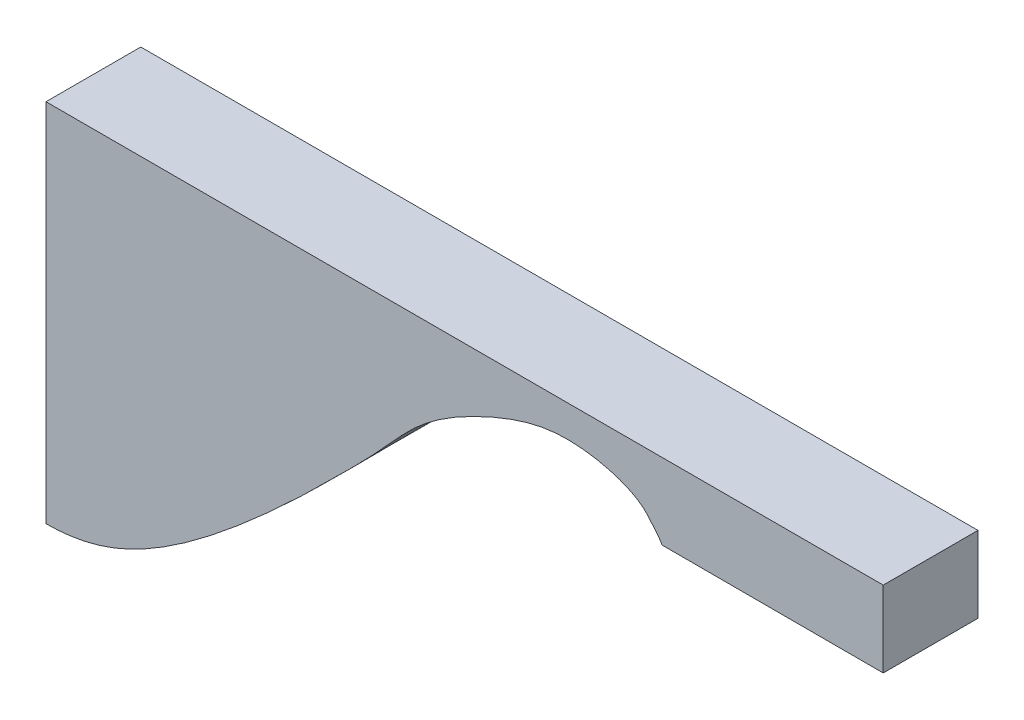
ISO-10303-21;
HEADER;
FILE_DESCRIPTION(('STEP AP214'),'2;1');
FILE_NAME('part.step','',(''),(''),'','','');
FILE_SCHEMA(('AUTOMOTIVE_DESIGN { 1 0 10303 214 1 1 1 1 }'));
ENDSEC;
DATA;
#1=APPLICATION_CONTEXT('core data for automotive mechanical design processes');
#2=APPLICATION_PROTOCOL_DEFINITION('international standard','automotive_design',2000,#1);
#3=PRODUCT_CONTEXT('',#1,'mechanical');
#4=PRODUCT('Part','Part','',(#3));
#5=PRODUCT_RELATED_PRODUCT_CATEGORY('part','',(#4));
#6=PRODUCT_DEFINITION_FORMATION('','',#4);
#7=PRODUCT_DEFINITION_CONTEXT('part definition',#1,'design');
#8=PRODUCT_DEFINITION('design','',#6,#7);
#9=PRODUCT_DEFINITION_SHAPE('','',#8);
#10=(LENGTH_UNIT() NAMED_UNIT(*) SI_UNIT(.MILLI.,.METRE.));
#11=(NAMED_UNIT(*) PLANE_ANGLE_UNIT() SI_UNIT($,.RADIAN.));
#12=(NAMED_UNIT(*) SI_UNIT($,.STERADIAN.) SOLID_ANGLE_UNIT());
#13=UNCERTAINTY_MEASURE_WITH_UNIT(LENGTH_MEASURE(1.E-05),#10,'distance_accuracy_value','');
#14=(GEOMETRIC_REPRESENTATION_CONTEXT(3) GLOBAL_UNCERTAINTY_ASSIGNED_CONTEXT((#13)) GLOBAL_UNIT_ASSIGNED_CONTEXT((#10,
#11,#12)) REPRESENTATION_CONTEXT('',''));
#15=CARTESIAN_POINT('',(0.,0.,0.));
#16=DIRECTION('',(0.,0.,1.));
#17=DIRECTION('',(1.,0.,0.));
#18=AXIS2_PLACEMENT_3D('',#15,#16,#17);
#19=CARTESIAN_POINT('',(117.55917187078,-4.17121153115289,59.9999999999997));
#20=DIRECTION('',(0.999999999999814,6.09113935374505E-07,0.));
#21=DIRECTION('',(-6.09113935374505E-07,0.999999999999814,0.));
#22=AXIS2_PLACEMENT_3D('',#19,#20,#21);
#23=PLANE('',#22);
#24=DIRECTION('',(-6.09113935374505E-07,0.999999999999814,0.));
#25=VECTOR('',#24,1.);
#26=CARTESIAN_POINT('',(117.55917187078,-4.17121153115289,67.9999999999997));
#27=LINE('',#26,#25);
#28=CARTESIAN_POINT('',(117.55917187078,-4.17121153115289,67.9999999999997));
#29=VERTEX_POINT('',#28);
#30=CARTESIAN_POINT('',(117.559167955876,2.25600000000004,67.9999999999997));
#31=VERTEX_POINT('',#30);
#32=EDGE_CURVE('E154',#29,#31,#27,.T.);
#33=ORIENTED_EDGE('',*,*,#32,.F.);
#34=DIRECTION('',(0.,0.,1.));
#35=VECTOR('',#34,1.);
#36=CARTESIAN_POINT('',(117.55917187078,-4.17121153115289,59.9999999999997));
#37=LINE('',#36,#35);
#38=CARTESIAN_POINT('',(117.55917187078,-4.17121153115289,59.9999999999997));
#39=VERTEX_POINT('',#38);
#40=EDGE_CURVE('E11',#39,#29,#37,.T.);
#41=ORIENTED_EDGE('',*,*,#40,.F.);
#42=DIRECTION('',(-6.09113935374505E-07,0.999999999999814,0.));
#43=VECTOR('',#42,1.);
#44=CARTESIAN_POINT('',(117.55917187078,-4.17121153115289,59.9999999999997));
#45=LINE('',#44,#43);
#46=CARTESIAN_POINT('',(117.559167955876,2.25600000000004,59.9999999999997));
#47=VERTEX_POINT('',#46);
#48=EDGE_CURVE('E108',#39,#47,#45,.T.);
#49=ORIENTED_EDGE('',*,*,#48,.T.);
#50=DIRECTION('',(0.,0.,1.));
#51=VECTOR('',#50,1.);
#52=CARTESIAN_POINT('',(117.559167955876,2.25600000000004,59.9999999999997));
#53=LINE('',#52,#51);
#54=EDGE_CURVE('E77',#47,#31,#53,.T.);
#55=ORIENTED_EDGE('',*,*,#54,.T.);
#56=EDGE_LOOP('',(#33,#41,#49,#55));
#57=FACE_BOUND('',#56,.T.);
#58=ADVANCED_FACE('F30',(#57),#23,.T.);
#59=CARTESIAN_POINT('',(98.8755610018275,-4.15342704151391,59.9999999999997));
#60=CARTESIAN_POINT('',(105.103431048449,-4.15960524690506,59.9999999999997));
#61=CARTESIAN_POINT('',(111.331301380457,-4.16549807274983,59.9999999999997));
#62=CARTESIAN_POINT('',(117.55917187078,-4.17121153115289,59.9999999999997));
#63=B_SPLINE_CURVE_WITH_KNOTS('',3,(#59,#60,#61,#62),.UNSPECIFIED.,.F.,.F.,(4,4),(0.,1.),.UNSPECIFIED.);
#64=DIRECTION('',(0.,0.,1.));
#65=VECTOR('',#64,1.);
#66=SURFACE_OF_LINEAR_EXTRUSION('',#63,#65);
#67=CARTESIAN_POINT('',(117.55917187078,-4.17121153115289,67.9999999999997));
#68=CARTESIAN_POINT('',(111.331301380457,-4.16549807274983,67.9999999999997));
#69=CARTESIAN_POINT('',(105.103431048449,-4.15960524690506,67.9999999999997));
#70=CARTESIAN_POINT('',(98.8755610018275,-4.15342704151391,67.9999999999997));
#71=B_SPLINE_CURVE_WITH_KNOTS('',3,(#67,#68,#69,#70),.UNSPECIFIED.,.F.,.F.,(4,4),(0.,1.),.UNSPECIFIED.);
#72=CARTESIAN_POINT('',(98.8755610018274,-4.15342704151393,67.9999999999997));
#73=VERTEX_POINT('',#72);
#74=EDGE_CURVE('E150',#73,#29,#71,.F.);
#75=ORIENTED_EDGE('',*,*,#74,.F.);
#76=DIRECTION('',(0.,0.,1.));
#77=VECTOR('',#76,1.);
#78=CARTESIAN_POINT('',(98.8755610018274,-4.15342704151393,59.9999999999997));
#79=LINE('',#78,#77);
#80=CARTESIAN_POINT('',(98.8755610018274,-4.15342704151393,59.9999999999997));
#81=VERTEX_POINT('',#80);
#82=EDGE_CURVE('E39',#81,#73,#79,.T.);
#83=ORIENTED_EDGE('',*,*,#82,.F.);
#84=CARTESIAN_POINT('',(98.8755610018275,-4.15342704151391,59.9999999999997));
#85=CARTESIAN_POINT('',(105.103431048449,-4.15960524690506,59.9999999999997));
#86=CARTESIAN_POINT('',(111.331301380457,-4.16549807274983,59.9999999999997));
#87=CARTESIAN_POINT('',(117.55917187078,-4.17121153115289,59.9999999999997));
#88=B_SPLINE_CURVE_WITH_KNOTS('',3,(#84,#85,#86,#87),.UNSPECIFIED.,.F.,.F.,(4,4),(0.,1.),.UNSPECIFIED.);
#89=EDGE_CURVE('E101',#81,#39,#88,.T.);
#90=ORIENTED_EDGE('',*,*,#89,.T.);
#91=ORIENTED_EDGE('',*,*,#40,.T.);
#92=EDGE_LOOP('',(#75,#83,#90,#91));
#93=FACE_BOUND('',#92,.T.);
#94=ADVANCED_FACE('F133',(#93),#66,.T.);
#95=CARTESIAN_POINT('',(46.8903743110804,-28.596883207131,59.9999999999997));
#96=CARTESIAN_POINT('',(47.5442365086491,-28.5907072029155,59.9999999999997));
#97=CARTESIAN_POINT('',(48.1984598564595,-28.5510189691388,59.9999999999997));
#98=CARTESIAN_POINT('',(49.1804895711758,-28.4270239416478,59.9999999999997));
#99=CARTESIAN_POINT('',(49.5092564045231,-28.3747651557727,59.9999999999997));
#100=CARTESIAN_POINT('',(50.16040333774,-28.2490262914415,59.9999999999997));
#101=CARTESIAN_POINT('',(50.4817734591461,-28.1758546857247,59.9999999999997));
#102=CARTESIAN_POINT('',(52.0687503033664,-27.7612871308645,59.9999999999997));
#103=CARTESIAN_POINT('',(53.2737749166432,-27.2714076819132,59.9999999999997));
#104=CARTESIAN_POINT('',(55.60284513252,-26.0931735739515,59.9999999999997));
#105=CARTESIAN_POINT('',(56.7322555517637,-25.4039539523767,59.9999999999997));
#106=CARTESIAN_POINT('',(58.9087326698377,-23.9357046078205,59.9999999999997));
#107=CARTESIAN_POINT('',(59.9603082250726,-23.1540833850424,59.9999999999997));
#108=CARTESIAN_POINT('',(62.018623710139,-21.5327568403852,59.9999999999997));
#109=CARTESIAN_POINT('',(63.0248066212777,-20.692329906425,59.9999999999997));
#110=CARTESIAN_POINT('',(65.0074640440431,-18.9729891075018,59.9999999999997));
#111=CARTESIAN_POINT('',(65.9840594016845,-18.0939268320721,59.9999999999997));
#112=CARTESIAN_POINT('',(67.9093642016245,-16.307999640975,59.9999999999997));
#113=CARTESIAN_POINT('',(68.857398454762,-15.399138656505,59.9999999999997));
#114=CARTESIAN_POINT('',(70.7347837958604,-13.5624690886792,59.9999999999997));
#115=CARTESIAN_POINT('',(71.6679657509885,-12.6386875895223,59.9999999999997));
#116=CARTESIAN_POINT('',(73.0583569833913,-11.2437425973995,59.9999999999997));
#117=CARTESIAN_POINT('',(73.5189708661399,-10.7759441696053,59.9999999999997));
#118=CARTESIAN_POINT('',(74.428563488617,-9.82884729886254,59.9999999999997));
#119=CARTESIAN_POINT('',(74.8765528139027,-9.34855606107691,59.9999999999997));
#120=CARTESIAN_POINT('',(75.7622049606279,-8.37783042719721,59.9999999999997));
#121=CARTESIAN_POINT('',(76.2019128766526,-7.88948476496503,59.9999999999997));
#122=CARTESIAN_POINT('',(77.0980350594773,-6.9287748212849,59.9999999999997));
#123=CARTESIAN_POINT('',(77.5542044736502,-6.45617631255884,59.9999999999997));
#124=CARTESIAN_POINT('',(78.5210210739398,-5.56309301098736,59.9999999999997));
#125=CARTESIAN_POINT('',(79.0268635605564,-5.14632604593906,59.9999999999997));
#126=CARTESIAN_POINT('',(80.0754781028246,-4.37539755204517,59.9999999999997));
#127=CARTESIAN_POINT('',(80.6189236656623,-4.01983764218453,59.9999999999997));
#128=CARTESIAN_POINT('',(81.7348542963756,-3.35409319665673,59.9999999999997));
#129=CARTESIAN_POINT('',(82.3073098653944,-3.04386256785999,59.9999999999997));
#130=CARTESIAN_POINT('',(83.4735184405562,-2.4566793973969,59.9999999999997));
#131=CARTESIAN_POINT('',(84.0686061951216,-2.18044543676049,59.9999999999997));
#132=CARTESIAN_POINT('',(85.8670792694604,-1.40574282297812,59.9999999999997));
#133=CARTESIAN_POINT('',(87.0882694123907,-0.955937913663051,59.9999999999997));
#134=CARTESIAN_POINT('',(88.6887281436307,-0.615725568518876,59.9999999999997));
#135=CARTESIAN_POINT('',(89.0138183692901,-0.558868330314372,59.9999999999997));
#136=CARTESIAN_POINT('',(89.6671797652833,-0.472591179892097,59.9999999999997));
#137=CARTESIAN_POINT('',(89.9934333310263,-0.443628992558844,59.9999999999997));
#138=CARTESIAN_POINT('',(90.9709588556915,-0.397737427350776,59.9999999999997));
#139=CARTESIAN_POINT('',(91.6210347420661,-0.420505328771319,59.9999999999997));
#140=CARTESIAN_POINT('',(92.9184887265608,-0.555579892475018,59.9999999999997));
#141=CARTESIAN_POINT('',(93.5697346921998,-0.669633948304067,59.9999999999997));
#142=CARTESIAN_POINT('',(94.5253762509196,-0.906623185705946,59.9999999999997));
#143=CARTESIAN_POINT('',(94.8405040691058,-0.996933503547666,59.9999999999997));
#144=CARTESIAN_POINT('',(95.4615432368718,-1.20804932198439,59.9999999999997));
#145=CARTESIAN_POINT('',(95.7686827183471,-1.32861181508982,59.9999999999997));
#146=CARTESIAN_POINT('',(96.3681861005486,-1.60164174256283,59.9999999999997));
#147=CARTESIAN_POINT('',(96.6570230041086,-1.75489089614139,59.9999999999997));
#148=CARTESIAN_POINT('',(97.0616431733103,-2.02866714309261,59.9999999999997));
#149=CARTESIAN_POINT('',(97.1915299362456,-2.12757122270766,59.9999999999997));
#150=CARTESIAN_POINT('',(97.4398770399606,-2.34289799298334,59.9999999999997));
#151=CARTESIAN_POINT('',(97.558295361094,-2.46062166937449,59.9999999999997));
#152=CARTESIAN_POINT('',(97.8974787923898,-2.8261537033274,59.9999999999997));
#153=CARTESIAN_POINT('',(98.1032682205362,-3.08674680923261,59.9999999999997));
#154=CARTESIAN_POINT('',(98.418738253266,-3.4719945639211,59.9999999999997));
#155=CARTESIAN_POINT('',(98.5259969995657,-3.59866278665286,59.9999999999997));
#156=CARTESIAN_POINT('',(98.7282510385825,-3.8621952748899,59.9999999999997));
#157=CARTESIAN_POINT('',(98.8199251527387,-4.00394774024481,59.9999999999997));
#158=CARTESIAN_POINT('',(98.8755610018274,-4.15342704151393,59.9999999999997));
#159=B_SPLINE_CURVE_WITH_KNOTS('',3,(#95,#96,#97,#98,#99,#100,#101,#102,#103,#104,#105,#106,
#107,#108,#109,#110,#111,#112,#113,#114,#115,#116,#117,#118,#119,#120,#121,#122,#123,#124,#125,
#126,#127,#128,#129,#130,#131,#132,#133,#134,#135,#136,#137,#138,#139,#140,#141,#142,#143,#144,
#145,#146,#147,#148,#149,#150,#151,#152,#153,#154,#155,#156,#157,#158),.UNSPECIFIED.,.F.,.F.,(4,
2,2,2,2,2,2,2,2,2,2,2,2,2,2,2,2,2,2,2,2,2,2,2,2,2,2,2,2,2,2,4),(0.,0.0312499999999997,
0.0468749999999998,0.0624999999999998,0.125,0.187499999999999,0.249999999999999,
0.312499999999999,0.374999999999999,0.437499999999999,0.499999999999999,0.531249999999999,
0.562499999999999,0.59375,0.625,0.656249999999999,0.687499999999999,0.718749999999999,
0.749999999999999,0.812499999999999,0.828124999999999,0.843749999999999,0.874999999999999,
0.90625,0.921875,0.9375,0.953125,0.9609375,0.96875,0.984375,0.9921875,1.),.UNSPECIFIED.);
#160=DIRECTION('',(0.,0.,1.));
#161=VECTOR('',#160,1.);
#162=SURFACE_OF_LINEAR_EXTRUSION('',#159,#161);
#163=CARTESIAN_POINT('',(98.8755610018274,-4.15342704151393,67.9999999999996));
#164=CARTESIAN_POINT('',(98.8199251527387,-4.00394774024481,67.9999999999996));
#165=CARTESIAN_POINT('',(98.7282510385825,-3.8621952748899,67.9999999999996));
#166=CARTESIAN_POINT('',(98.5259969995657,-3.59866278665286,67.9999999999996));
#167=CARTESIAN_POINT('',(98.418738253266,-3.4719945639211,67.9999999999996));
#168=CARTESIAN_POINT('',(98.1032682205362,-3.08674680923261,67.9999999999996));
#169=CARTESIAN_POINT('',(97.8974787923898,-2.8261537033274,67.9999999999996));
#170=CARTESIAN_POINT('',(97.558295361094,-2.46062166937449,67.9999999999996));
#171=CARTESIAN_POINT('',(97.4398770399606,-2.34289799298334,67.9999999999996));
#172=CARTESIAN_POINT('',(97.1915299362456,-2.12757122270766,67.9999999999996));
#173=CARTESIAN_POINT('',(97.0616431733103,-2.02866714309261,67.9999999999996));
#174=CARTESIAN_POINT('',(96.6570230041086,-1.75489089614139,67.9999999999996));
#175=CARTESIAN_POINT('',(96.3681861005486,-1.60164174256283,67.9999999999996));
#176=CARTESIAN_POINT('',(95.7686827183471,-1.32861181508982,67.9999999999996));
#177=CARTESIAN_POINT('',(95.4615432368718,-1.20804932198439,67.9999999999996));
#178=CARTESIAN_POINT('',(94.8405040691058,-0.996933503547666,67.9999999999996));
#179=CARTESIAN_POINT('',(94.5253762509196,-0.906623185705946,67.9999999999996));
#180=CARTESIAN_POINT('',(93.5697346921998,-0.669633948304067,67.9999999999996));
#181=CARTESIAN_POINT('',(92.9184887265608,-0.555579892475018,67.9999999999996));
#182=CARTESIAN_POINT('',(91.6210347420661,-0.420505328771319,67.9999999999996));
#183=CARTESIAN_POINT('',(90.9709588556915,-0.397737427350776,67.9999999999996));
#184=CARTESIAN_POINT('',(89.9934333310263,-0.443628992558844,67.9999999999996));
#185=CARTESIAN_POINT('',(89.6671797652833,-0.472591179892097,67.9999999999996));
#186=CARTESIAN_POINT('',(89.0138183692901,-0.558868330314372,67.9999999999996));
#187=CARTESIAN_POINT('',(88.6887281436307,-0.615725568518876,67.9999999999996));
#188=CARTESIAN_POINT('',(87.0882694123907,-0.955937913663051,67.9999999999996));
#189=CARTESIAN_POINT('',(85.8670792694604,-1.40574282297812,67.9999999999996));
#190=CARTESIAN_POINT('',(84.0686061951216,-2.18044543676049,67.9999999999996));
#191=CARTESIAN_POINT('',(83.4735184405562,-2.4566793973969,67.9999999999996));
#192=CARTESIAN_POINT('',(82.3073098653944,-3.04386256785999,67.9999999999996));
#193=CARTESIAN_POINT('',(81.7348542963756,-3.35409319665673,67.9999999999996));
#194=CARTESIAN_POINT('',(80.6189236656623,-4.01983764218453,67.9999999999996));
#195=CARTESIAN_POINT('',(80.0754781028246,-4.37539755204517,67.9999999999996));
#196=CARTESIAN_POINT('',(79.0268635605564,-5.14632604593906,67.9999999999996));
#197=CARTESIAN_POINT('',(78.5210210739398,-5.56309301098736,67.9999999999996));
#198=CARTESIAN_POINT('',(77.5542044736502,-6.45617631255884,67.9999999999996));
#199=CARTESIAN_POINT('',(77.0980350594773,-6.9287748212849,67.9999999999996));
#200=CARTESIAN_POINT('',(76.2019128766526,-7.88948476496503,67.9999999999996));
#201=CARTESIAN_POINT('',(75.7622049606279,-8.37783042719721,67.9999999999996));
#202=CARTESIAN_POINT('',(74.8765528139027,-9.34855606107691,67.9999999999996));
#203=CARTESIAN_POINT('',(74.428563488617,-9.82884729886254,67.9999999999996));
#204=CARTESIAN_POINT('',(73.5189708661399,-10.7759441696053,67.9999999999996));
#205=CARTESIAN_POINT('',(73.0583569833913,-11.2437425973995,67.9999999999996));
#206=CARTESIAN_POINT('',(71.6679657509885,-12.6386875895223,67.9999999999996));
#207=CARTESIAN_POINT('',(70.7347837958604,-13.5624690886792,67.9999999999996));
#208=CARTESIAN_POINT('',(68.857398454762,-15.399138656505,67.9999999999996));
#209=CARTESIAN_POINT('',(67.9093642016245,-16.307999640975,67.9999999999996));
#210=CARTESIAN_POINT('',(65.9840594016845,-18.0939268320721,67.9999999999996));
#211=CARTESIAN_POINT('',(65.0074640440431,-18.9729891075018,67.9999999999996));
#212=CARTESIAN_POINT('',(63.0248066212777,-20.692329906425,67.9999999999996));
#213=CARTESIAN_POINT('',(62.018623710139,-21.5327568403852,67.9999999999996));
#214=CARTESIAN_POINT('',(59.9603082250726,-23.1540833850424,67.9999999999996));
#215=CARTESIAN_POINT('',(58.9087326698377,-23.9357046078205,67.9999999999996));
#216=CARTESIAN_POINT('',(56.7322555517637,-25.4039539523767,67.9999999999996));
#217=CARTESIAN_POINT('',(55.60284513252,-26.0931735739515,67.9999999999996));
#218=CARTESIAN_POINT('',(53.2737749166432,-27.2714076819132,67.9999999999996));
#219=CARTESIAN_POINT('',(52.0687503033664,-27.7612871308645,67.9999999999996));
#220=CARTESIAN_POINT('',(50.4817734591461,-28.1758546857247,67.9999999999996));
#221=CARTESIAN_POINT('',(50.16040333774,-28.2490262914415,67.9999999999996));
#222=CARTESIAN_POINT('',(49.5092564045231,-28.3747651557727,67.9999999999996));
#223=CARTESIAN_POINT('',(49.1804895711758,-28.4270239416478,67.9999999999996));
#224=CARTESIAN_POINT('',(48.1984598564595,-28.5510189691388,67.9999999999996));
#225=CARTESIAN_POINT('',(47.5442365086491,-28.5907072029155,67.9999999999996));
#226=CARTESIAN_POINT('',(46.8903743110804,-28.596883207131,67.9999999999996));
#227=B_SPLINE_CURVE_WITH_KNOTS('',3,(#163,#164,#165,#166,#167,#168,#169,#170,#171,#172,#173,
#174,#175,#176,#177,#178,#179,#180,#181,#182,#183,#184,#185,#186,#187,#188,#189,#190,#191,#192,
#193,#194,#195,#196,#197,#198,#199,#200,#201,#202,#203,#204,#205,#206,#207,#208,#209,#210,#211,
#212,#213,#214,#215,#216,#217,#218,#219,#220,#221,#222,#223,#224,#225,#226),.UNSPECIFIED.,.F.,
.F.,(4,2,2,2,2,2,2,2,2,2,2,2,2,2,2,2,2,2,2,2,2,2,2,2,2,2,2,2,2,2,2,4),(0.,0.00781249999999978,
0.0156249999999997,0.0312499999999998,0.0390624999999998,0.0468749999999998,0.0625,
0.0781250000000002,0.0937500000000004,0.125000000000001,0.156250000000001,0.171875000000001,
0.187500000000001,0.250000000000001,0.281250000000001,0.312500000000001,0.343750000000001,0.375,
0.40625,0.437500000000001,0.468750000000001,0.500000000000001,0.562500000000001,
0.625000000000001,0.687500000000001,0.750000000000001,0.812500000000001,0.875,0.9375,0.953125,
0.96875,1.),.UNSPECIFIED.);
#228=CARTESIAN_POINT('',(46.8903743110804,-28.596883207131,67.9999999999997));
#229=VERTEX_POINT('',#228);
#230=EDGE_CURVE('E88',#229,#73,#227,.F.);
#231=ORIENTED_EDGE('',*,*,#230,.F.);
#232=DIRECTION('',(0.,0.,1.));
#233=VECTOR('',#232,1.);
#234=CARTESIAN_POINT('',(46.8903743110804,-28.596883207131,59.9999999999997));
#235=LINE('',#234,#233);
#236=CARTESIAN_POINT('',(46.8903743110804,-28.596883207131,59.9999999999997));
#237=VERTEX_POINT('',#236);
#238=EDGE_CURVE('E82',#237,#229,#235,.T.);
#239=ORIENTED_EDGE('',*,*,#238,.F.);
#240=CARTESIAN_POINT('',(46.8903743110804,-28.596883207131,59.9999999999997));
#241=CARTESIAN_POINT('',(47.5442365086491,-28.5907072029155,59.9999999999997));
#242=CARTESIAN_POINT('',(48.1984598564595,-28.5510189691388,59.9999999999997));
#243=CARTESIAN_POINT('',(49.1804895711758,-28.4270239416478,59.9999999999997));
#244=CARTESIAN_POINT('',(49.5092564045231,-28.3747651557727,59.9999999999997));
#245=CARTESIAN_POINT('',(50.16040333774,-28.2490262914415,59.9999999999997));
#246=CARTESIAN_POINT('',(50.4817734591461,-28.1758546857247,59.9999999999997));
#247=CARTESIAN_POINT('',(52.0687503033664,-27.7612871308645,59.9999999999997));
#248=CARTESIAN_POINT('',(53.2737749166432,-27.2714076819132,59.9999999999997));
#249=CARTESIAN_POINT('',(55.60284513252,-26.0931735739515,59.9999999999997));
#250=CARTESIAN_POINT('',(56.7322555517637,-25.4039539523767,59.9999999999997));
#251=CARTESIAN_POINT('',(58.9087326698377,-23.9357046078205,59.9999999999997));
#252=CARTESIAN_POINT('',(59.9603082250726,-23.1540833850424,59.9999999999997));
#253=CARTESIAN_POINT('',(62.018623710139,-21.5327568403852,59.9999999999997));
#254=CARTESIAN_POINT('',(63.0248066212777,-20.692329906425,59.9999999999997));
#255=CARTESIAN_POINT('',(65.0074640440431,-18.9729891075018,59.9999999999997));
#256=CARTESIAN_POINT('',(65.9840594016845,-18.0939268320721,59.9999999999997));
#257=CARTESIAN_POINT('',(67.9093642016245,-16.307999640975,59.9999999999997));
#258=CARTESIAN_POINT('',(68.857398454762,-15.399138656505,59.9999999999997));
#259=CARTESIAN_POINT('',(70.7347837958604,-13.5624690886792,59.9999999999997));
#260=CARTESIAN_POINT('',(71.6679657509885,-12.6386875895223,59.9999999999997));
#261=CARTESIAN_POINT('',(73.0583569833913,-11.2437425973995,59.9999999999997));
#262=CARTESIAN_POINT('',(73.5189708661399,-10.7759441696053,59.9999999999997));
#263=CARTESIAN_POINT('',(74.428563488617,-9.82884729886254,59.9999999999997));
#264=CARTESIAN_POINT('',(74.8765528139027,-9.34855606107691,59.9999999999997));
#265=CARTESIAN_POINT('',(75.7622049606279,-8.37783042719721,59.9999999999997));
#266=CARTESIAN_POINT('',(76.2019128766526,-7.88948476496503,59.9999999999997));
#267=CARTESIAN_POINT('',(77.0980350594773,-6.9287748212849,59.9999999999997));
#268=CARTESIAN_POINT('',(77.5542044736502,-6.45617631255884,59.9999999999997));
#269=CARTESIAN_POINT('',(78.5210210739398,-5.56309301098736,59.9999999999997));
#270=CARTESIAN_POINT('',(79.0268635605564,-5.14632604593906,59.9999999999997));
#271=CARTESIAN_POINT('',(80.0754781028246,-4.37539755204517,59.9999999999997));
#272=CARTESIAN_POINT('',(80.6189236656623,-4.01983764218453,59.9999999999997));
#273=CARTESIAN_POINT('',(81.7348542963756,-3.35409319665673,59.9999999999997));
#274=CARTESIAN_POINT('',(82.3073098653944,-3.04386256785999,59.9999999999997));
#275=CARTESIAN_POINT('',(83.4735184405562,-2.4566793973969,59.9999999999997));
#276=CARTESIAN_POINT('',(84.0686061951216,-2.18044543676049,59.9999999999997));
#277=CARTESIAN_POINT('',(85.8670792694604,-1.40574282297812,59.9999999999997));
#278=CARTESIAN_POINT('',(87.0882694123907,-0.955937913663051,59.9999999999997));
#279=CARTESIAN_POINT('',(88.6887281436307,-0.615725568518876,59.9999999999997));
#280=CARTESIAN_POINT('',(89.0138183692901,-0.558868330314372,59.9999999999997));
#281=CARTESIAN_POINT('',(89.6671797652833,-0.472591179892097,59.9999999999997));
#282=CARTESIAN_POINT('',(89.9934333310263,-0.443628992558844,59.9999999999997));
#283=CARTESIAN_POINT('',(90.9709588556915,-0.397737427350776,59.9999999999997));
#284=CARTESIAN_POINT('',(91.6210347420661,-0.420505328771319,59.9999999999997));
#285=CARTESIAN_POINT('',(92.9184887265608,-0.555579892475018,59.9999999999997));
#286=CARTESIAN_POINT('',(93.5697346921998,-0.669633948304067,59.9999999999997));
#287=CARTESIAN_POINT('',(94.5253762509196,-0.906623185705946,59.9999999999997));
#288=CARTESIAN_POINT('',(94.8405040691058,-0.996933503547666,59.9999999999997));
#289=CARTESIAN_POINT('',(95.4615432368718,-1.20804932198439,59.9999999999997));
#290=CARTESIAN_POINT('',(95.7686827183471,-1.32861181508982,59.9999999999997));
#291=CARTESIAN_POINT('',(96.3681861005486,-1.60164174256283,59.9999999999997));
#292=CARTESIAN_POINT('',(96.6570230041086,-1.75489089614139,59.9999999999997));
#293=CARTESIAN_POINT('',(97.0616431733103,-2.02866714309261,59.9999999999997));
#294=CARTESIAN_POINT('',(97.1915299362456,-2.12757122270766,59.9999999999997));
#295=CARTESIAN_POINT('',(97.4398770399606,-2.34289799298334,59.9999999999997));
#296=CARTESIAN_POINT('',(97.558295361094,-2.46062166937449,59.9999999999997));
#297=CARTESIAN_POINT('',(97.8974787923898,-2.8261537033274,59.9999999999997));
#298=CARTESIAN_POINT('',(98.1032682205362,-3.08674680923261,59.9999999999997));
#299=CARTESIAN_POINT('',(98.418738253266,-3.4719945639211,59.9999999999997));
#300=CARTESIAN_POINT('',(98.5259969995657,-3.59866278665286,59.9999999999997));
#301=CARTESIAN_POINT('',(98.7282510385825,-3.8621952748899,59.9999999999997));
#302=CARTESIAN_POINT('',(98.8199251527387,-4.00394774024481,59.9999999999997));
#303=CARTESIAN_POINT('',(98.8755610018274,-4.15342704151393,59.9999999999997));
#304=B_SPLINE_CURVE_WITH_KNOTS('',3,(#240,#241,#242,#243,#244,#245,#246,#247,#248,#249,#250,
#251,#252,#253,#254,#255,#256,#257,#258,#259,#260,#261,#262,#263,#264,#265,#266,#267,#268,#269,
#270,#271,#272,#273,#274,#275,#276,#277,#278,#279,#280,#281,#282,#283,#284,#285,#286,#287,#288,
#289,#290,#291,#292,#293,#294,#295,#296,#297,#298,#299,#300,#301,#302,#303),.UNSPECIFIED.,.F.,
.F.,(4,2,2,2,2,2,2,2,2,2,2,2,2,2,2,2,2,2,2,2,2,2,2,2,2,2,2,2,2,2,2,4),(0.,0.0312499999999997,
0.0468749999999998,0.0624999999999998,0.125,0.187499999999999,0.249999999999999,
0.312499999999999,0.374999999999999,0.437499999999999,0.499999999999999,0.531249999999999,
0.562499999999999,0.59375,0.625,0.656249999999999,0.687499999999999,0.718749999999999,
0.749999999999999,0.812499999999999,0.828124999999999,0.843749999999999,0.874999999999999,
0.90625,0.921875,0.9375,0.953125,0.9609375,0.96875,0.984375,0.9921875,1.),.UNSPECIFIED.);
#305=EDGE_CURVE('E85',#237,#81,#304,.T.);
#306=ORIENTED_EDGE('',*,*,#305,.T.);
#307=ORIENTED_EDGE('',*,*,#82,.T.);
#308=EDGE_LOOP('',(#231,#239,#306,#307));
#309=FACE_BOUND('',#308,.T.);
#310=ADVANCED_FACE('F84',(#309),#162,.T.);
#311=CARTESIAN_POINT('',(46.890227777715,2.25600000000003,59.9999999999997));
#312=DIRECTION('',(-0.999999999988721,-4.74942210102873E-06,0.));
#313=DIRECTION('',(4.74942210102873E-06,-0.999999999988721,0.));
#314=AXIS2_PLACEMENT_3D('',#311,#312,#313);
#315=PLANE('',#314);
#316=DIRECTION('',(4.74942210102873E-06,-0.999999999988721,0.));
#317=VECTOR('',#316,1.);
#318=CARTESIAN_POINT('',(46.890227777715,2.25600000000003,67.9999999999997));
#319=LINE('',#318,#317);
#320=CARTESIAN_POINT('',(46.890227777715,2.25600000000003,67.9999999999997));
#321=VERTEX_POINT('',#320);
#322=EDGE_CURVE('E191',#321,#229,#319,.T.);
#323=ORIENTED_EDGE('',*,*,#322,.F.);
#324=DIRECTION('',(0.,0.,1.));
#325=VECTOR('',#324,1.);
#326=CARTESIAN_POINT('',(46.890227777715,2.25600000000003,59.9999999999997));
#327=LINE('',#326,#325);
#328=CARTESIAN_POINT('',(46.890227777715,2.25600000000003,59.9999999999997));
#329=VERTEX_POINT('',#328);
#330=EDGE_CURVE('E94',#329,#321,#327,.T.);
#331=ORIENTED_EDGE('',*,*,#330,.F.);
#332=DIRECTION('',(4.74942210102873E-06,-0.999999999988721,0.));
#333=VECTOR('',#332,1.);
#334=CARTESIAN_POINT('',(46.890227777715,2.25600000000003,59.9999999999997));
#335=LINE('',#334,#333);
#336=EDGE_CURVE('E100',#329,#237,#335,.T.);
#337=ORIENTED_EDGE('',*,*,#336,.T.);
#338=ORIENTED_EDGE('',*,*,#238,.T.);
#339=EDGE_LOOP('',(#323,#331,#337,#338));
#340=FACE_BOUND('',#339,.T.);
#341=ADVANCED_FACE('F105',(#340),#315,.T.);
#342=CARTESIAN_POINT('',(117.559167955876,2.25600000000004,59.9999999999997));
#343=DIRECTION('',(0.,1.,0.));
#344=DIRECTION('',(-1.,0.,0.));
#345=AXIS2_PLACEMENT_3D('',#342,#343,#344);
#346=PLANE('',#345);
#347=DIRECTION('',(-1.,0.,0.));
#348=VECTOR('',#347,1.);
#349=CARTESIAN_POINT('',(117.559167955876,2.25600000000004,67.9999999999997));
#350=LINE('',#349,#348);
#351=EDGE_CURVE('E162',#31,#321,#350,.T.);
#352=ORIENTED_EDGE('',*,*,#351,.F.);
#353=ORIENTED_EDGE('',*,*,#54,.F.);
#354=DIRECTION('',(-1.,0.,0.));
#355=VECTOR('',#354,1.);
#356=CARTESIAN_POINT('',(117.559167955876,2.25600000000004,59.9999999999997));
#357=LINE('',#356,#355);
#358=EDGE_CURVE('E106',#47,#329,#357,.T.);
#359=ORIENTED_EDGE('',*,*,#358,.T.);
#360=ORIENTED_EDGE('',*,*,#330,.T.);
#361=EDGE_LOOP('',(#352,#353,#359,#360));
#362=FACE_BOUND('',#361,.T.);
#363=ADVANCED_FACE('F224',(#362),#346,.T.);
#364=CARTESIAN_POINT('',(72.5948932392571,-11.7087242614404,59.9999999999997));
#365=DIRECTION('',(0.,0.,-1.));
#366=DIRECTION('',(-1.,0.,0.));
#367=AXIS2_PLACEMENT_3D('',#364,#365,#366);
#368=PLANE('',#367);
#369=ORIENTED_EDGE('',*,*,#48,.F.);
#370=ORIENTED_EDGE('',*,*,#89,.F.);
#371=ORIENTED_EDGE('',*,*,#305,.F.);
#372=ORIENTED_EDGE('',*,*,#336,.F.);
#373=ORIENTED_EDGE('',*,*,#358,.F.);
#374=EDGE_LOOP('',(#369,#370,#371,#372,#373));
#375=FACE_BOUND('',#374,.T.);
#376=ADVANCED_FACE('F99',(#375),#368,.T.);
#377=CARTESIAN_POINT('',(72.5948932392571,-11.7087242614404,67.9999999999997));
#378=DIRECTION('',(0.,0.,-1.));
#379=DIRECTION('',(-1.,0.,0.));
#380=AXIS2_PLACEMENT_3D('',#377,#378,#379);
#381=PLANE('',#380);
#382=ORIENTED_EDGE('',*,*,#32,.T.);
#383=ORIENTED_EDGE('',*,*,#351,.T.);
#384=ORIENTED_EDGE('',*,*,#322,.T.);
#385=ORIENTED_EDGE('',*,*,#230,.T.);
#386=ORIENTED_EDGE('',*,*,#74,.T.);
#387=EDGE_LOOP('',(#382,#383,#384,#385,#386));
#388=FACE_BOUND('',#387,.T.);
#389=ADVANCED_FACE('F122',(#388),#381,.F.);
#390=CLOSED_SHELL('',(#58,#94,#310,#341,#363,#376,#389));
#391=MANIFOLD_SOLID_BREP('B2',#390);
#392=ADVANCED_BREP_SHAPE_REPRESENTATION('',(#18,#391),#14);
#393=SHAPE_DEFINITION_REPRESENTATION(#9,#392);
ENDSEC;
END-ISO-10303-21;
